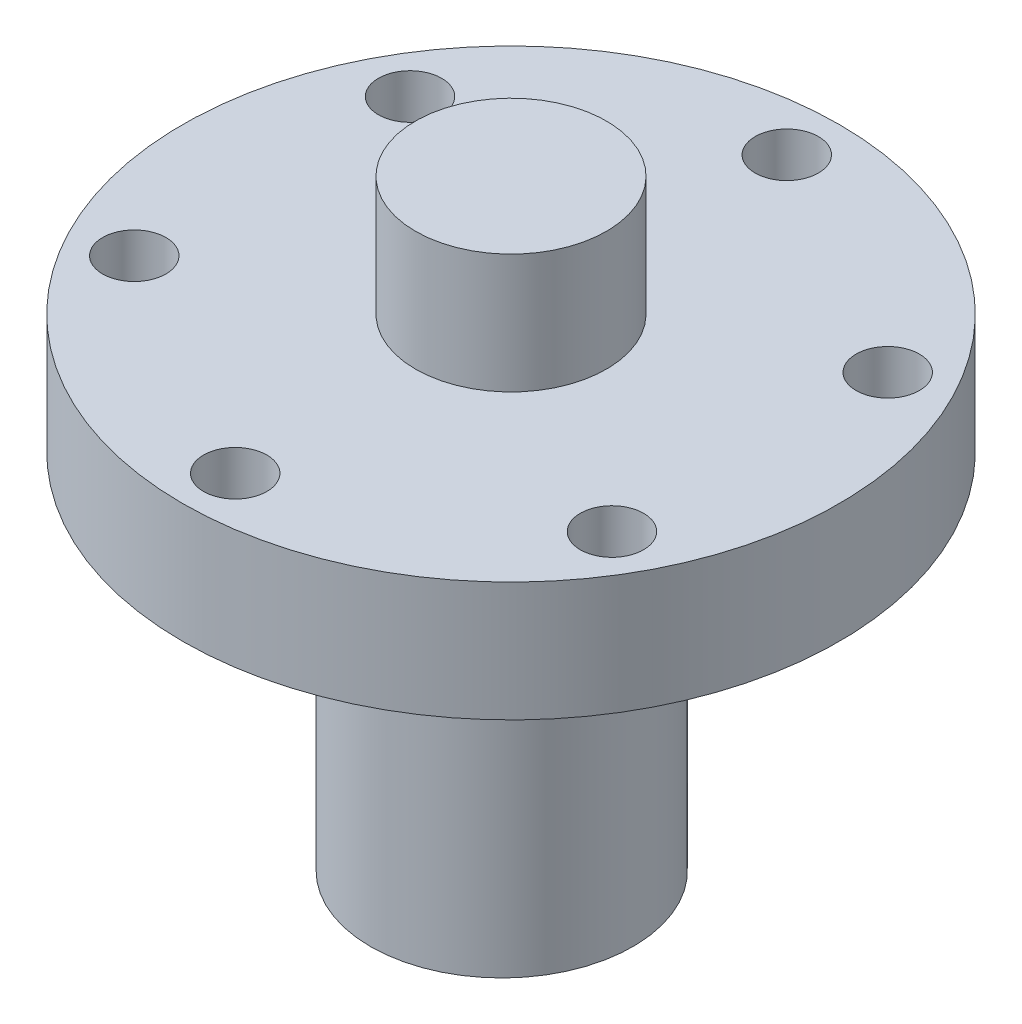
ISO-10303-21;
HEADER;
FILE_DESCRIPTION(('STEP AP214'),'2;1');
FILE_NAME('part.step','',(''),(''),'','','');
FILE_SCHEMA(('AUTOMOTIVE_DESIGN { 1 0 10303 214 1 1 1 1 }'));
ENDSEC;
DATA;
#1=APPLICATION_CONTEXT('core data for automotive mechanical design processes');
#2=APPLICATION_PROTOCOL_DEFINITION('international standard','automotive_design',2000,#1);
#3=PRODUCT_CONTEXT('',#1,'mechanical');
#4=PRODUCT('Part','Part','',(#3));
#5=PRODUCT_RELATED_PRODUCT_CATEGORY('part','',(#4));
#6=PRODUCT_DEFINITION_FORMATION('','',#4);
#7=PRODUCT_DEFINITION_CONTEXT('part definition',#1,'design');
#8=PRODUCT_DEFINITION('design','',#6,#7);
#9=PRODUCT_DEFINITION_SHAPE('','',#8);
#10=(LENGTH_UNIT() NAMED_UNIT(*) SI_UNIT(.MILLI.,.METRE.));
#11=(NAMED_UNIT(*) PLANE_ANGLE_UNIT() SI_UNIT($,.RADIAN.));
#12=(NAMED_UNIT(*) SI_UNIT($,.STERADIAN.) SOLID_ANGLE_UNIT());
#13=UNCERTAINTY_MEASURE_WITH_UNIT(LENGTH_MEASURE(1.E-05),#10,'distance_accuracy_value','');
#14=(GEOMETRIC_REPRESENTATION_CONTEXT(3) GLOBAL_UNCERTAINTY_ASSIGNED_CONTEXT((#13)) GLOBAL_UNIT_ASSIGNED_CONTEXT((#10,
#11,#12)) REPRESENTATION_CONTEXT('',''));
#15=CARTESIAN_POINT('',(0.,0.,0.));
#16=DIRECTION('',(0.,0.,1.));
#17=DIRECTION('',(1.,0.,0.));
#18=AXIS2_PLACEMENT_3D('',#15,#16,#17);
#19=CARTESIAN_POINT('',(0.,0.,0.));
#20=DIRECTION('',(0.,1.,0.));
#21=DIRECTION('',(0.,0.,1.));
#22=AXIS2_PLACEMENT_3D('',#19,#20,#21);
#23=PLANE('',#22);
#24=CARTESIAN_POINT('',(0.,0.,0.98290387426913));
#25=DIRECTION('',(0.,-1.,0.));
#26=DIRECTION('',(0.,0.,-1.));
#27=AXIS2_PLACEMENT_3D('',#24,#25,#26);
#28=CIRCLE('',#27,12.7);
#29=CARTESIAN_POINT('',(0.,0.,13.6829038742691));
#30=VERTEX_POINT('',#29);
#31=EDGE_CURVE('E100',#30,#30,#28,.T.);
#32=ORIENTED_EDGE('',*,*,#31,.T.);
#33=EDGE_LOOP('',(#32));
#34=FACE_BOUND('',#33,.T.);
#35=CARTESIAN_POINT('',(0.,0.,0.));
#36=DIRECTION('',(0.,1.,0.));
#37=DIRECTION('',(0.,0.,1.));
#38=AXIS2_PLACEMENT_3D('',#35,#36,#37);
#39=CIRCLE('',#38,2.54);
#40=CARTESIAN_POINT('',(0.,0.,2.54));
#41=VERTEX_POINT('',#40);
#42=EDGE_CURVE('E11',#41,#41,#39,.F.);
#43=ORIENTED_EDGE('',*,*,#42,.F.);
#44=EDGE_LOOP('',(#43));
#45=FACE_BOUND('',#44,.T.);
#46=ADVANCED_FACE('F34',(#34,#45),#23,.F.);
#47=CARTESIAN_POINT('',(25.4065872708242,0.,14.6684999999998));
#48=DIRECTION('',(0.,1.,0.));
#49=DIRECTION('',(-0.866025403784443,0.,-0.499999999999992));
#50=AXIS2_PLACEMENT_3D('',#47,#48,#49);
#51=CIRCLE('',#50,3.3655);
#52=CARTESIAN_POINT('',(22.4919787743877,0.,12.9857499999998));
#53=VERTEX_POINT('',#52);
#54=EDGE_CURVE('E79',#53,#53,#51,.T.);
#55=ORIENTED_EDGE('',*,*,#54,.T.);
#56=EDGE_LOOP('',(#55));
#57=FACE_BOUND('',#56,.T.);
#58=CARTESIAN_POINT('',(-25.406587270824,0.,14.6685000000001));
#59=DIRECTION('',(0.,1.,0.));
#60=DIRECTION('',(0.866025403784436,0.,-0.500000000000004));
#61=AXIS2_PLACEMENT_3D('',#58,#59,#60);
#62=CIRCLE('',#61,3.3655);
#63=CARTESIAN_POINT('',(-22.4919787743875,0.,12.9857500000001));
#64=VERTEX_POINT('',#63);
#65=EDGE_CURVE('E67',#64,#64,#62,.T.);
#66=ORIENTED_EDGE('',*,*,#65,.T.);
#67=EDGE_LOOP('',(#66));
#68=FACE_BOUND('',#67,.T.);
#69=CARTESIAN_POINT('',(0.,0.,-29.337));
#70=DIRECTION('',(0.,1.,0.));
#71=DIRECTION('',(0.,0.,1.));
#72=AXIS2_PLACEMENT_3D('',#69,#70,#71);
#73=CIRCLE('',#72,3.3655);
#74=CARTESIAN_POINT('',(0.,0.,-25.9715));
#75=VERTEX_POINT('',#74);
#76=EDGE_CURVE('E55',#75,#75,#73,.T.);
#77=ORIENTED_EDGE('',*,*,#76,.T.);
#78=EDGE_LOOP('',(#77));
#79=FACE_BOUND('',#78,.T.);
#80=CARTESIAN_POINT('',(0.,0.,0.));
#81=DIRECTION('',(0.,1.,0.));
#82=DIRECTION('',(0.,0.,1.));
#83=AXIS2_PLACEMENT_3D('',#80,#81,#82);
#84=CIRCLE('',#83,34.925);
#85=CARTESIAN_POINT('',(0.,0.,34.925));
#86=VERTEX_POINT('',#85);
#87=EDGE_CURVE('E49',#86,#86,#84,.T.);
#88=ORIENTED_EDGE('',*,*,#87,.F.);
#89=EDGE_LOOP('',(#88));
#90=FACE_BOUND('',#89,.T.);
#91=CARTESIAN_POINT('',(-25.4065872708241,0.,-14.6684999999999));
#92=DIRECTION('',(0.,1.,0.));
#93=DIRECTION('',(0.86602540378444,0.,0.499999999999998));
#94=AXIS2_PLACEMENT_3D('',#91,#92,#93);
#95=CIRCLE('',#94,3.3655);
#96=CARTESIAN_POINT('',(-22.4919787743876,0.,-12.9857499999999));
#97=VERTEX_POINT('',#96);
#98=EDGE_CURVE('E61',#97,#97,#95,.T.);
#99=ORIENTED_EDGE('',*,*,#98,.T.);
#100=EDGE_LOOP('',(#99));
#101=FACE_BOUND('',#100,.T.);
#102=CARTESIAN_POINT('',(2.04859176075282E-13,0.,29.337));
#103=DIRECTION('',(0.,1.,0.));
#104=DIRECTION('',(0.,0.,-1.));
#105=AXIS2_PLACEMENT_3D('',#102,#103,#104);
#106=CIRCLE('',#105,3.3655);
#107=CARTESIAN_POINT('',(1.81358015183529E-13,0.,25.9715));
#108=VERTEX_POINT('',#107);
#109=EDGE_CURVE('E73',#108,#108,#106,.T.);
#110=ORIENTED_EDGE('',*,*,#109,.T.);
#111=EDGE_LOOP('',(#110));
#112=FACE_BOUND('',#111,.T.);
#113=CARTESIAN_POINT('',(25.4065872708239,0.,-14.6685000000003));
#114=DIRECTION('',(0.,1.,0.));
#115=DIRECTION('',(-0.866025403784433,0.,0.50000000000001));
#116=AXIS2_PLACEMENT_3D('',#113,#114,#115);
#117=CIRCLE('',#116,3.3655);
#118=CARTESIAN_POINT('',(22.4919787743874,0.,-12.9857500000003));
#119=VERTEX_POINT('',#118);
#120=EDGE_CURVE('E85',#119,#119,#117,.T.);
#121=ORIENTED_EDGE('',*,*,#120,.T.);
#122=EDGE_LOOP('',(#121));
#123=FACE_BOUND('',#122,.T.);
#124=CARTESIAN_POINT('',(0.,0.,0.98290387426913));
#125=DIRECTION('',(0.,1.,0.));
#126=DIRECTION('',(0.,0.,1.));
#127=AXIS2_PLACEMENT_3D('',#124,#125,#126);
#128=CIRCLE('',#127,13.97);
#129=CARTESIAN_POINT('',(0.,0.,14.9529038742691));
#130=VERTEX_POINT('',#129);
#131=EDGE_CURVE('E41',#130,#130,#128,.F.);
#132=ORIENTED_EDGE('',*,*,#131,.F.);
#133=EDGE_LOOP('',(#132));
#134=FACE_BOUND('',#133,.T.);
#135=ADVANCED_FACE('F124',(#57,#68,#79,#90,#101,#112,#123,#134),#23,.F.);
#136=CARTESIAN_POINT('',(0.,12.7,0.));
#137=DIRECTION('',(0.,1.,0.));
#138=DIRECTION('',(0.,0.,1.));
#139=AXIS2_PLACEMENT_3D('',#136,#137,#138);
#140=PLANE('',#139);
#141=CARTESIAN_POINT('',(25.4065872708239,12.7,-14.6685000000003));
#142=DIRECTION('',(0.,1.,0.));
#143=DIRECTION('',(-0.866025403784433,0.,0.50000000000001));
#144=AXIS2_PLACEMENT_3D('',#141,#142,#143);
#145=CIRCLE('',#144,3.3655);
#146=CARTESIAN_POINT('',(22.4919787743874,12.7,-12.9857500000003));
#147=VERTEX_POINT('',#146);
#148=EDGE_CURVE('E82',#147,#147,#145,.T.);
#149=ORIENTED_EDGE('',*,*,#148,.F.);
#150=EDGE_LOOP('',(#149));
#151=FACE_BOUND('',#150,.T.);
#152=CARTESIAN_POINT('',(2.04859176075282E-13,12.7,29.337));
#153=DIRECTION('',(0.,1.,0.));
#154=DIRECTION('',(0.,0.,-1.));
#155=AXIS2_PLACEMENT_3D('',#152,#153,#154);
#156=CIRCLE('',#155,3.3655);
#157=CARTESIAN_POINT('',(1.81358015183529E-13,12.7,25.9715));
#158=VERTEX_POINT('',#157);
#159=EDGE_CURVE('E70',#158,#158,#156,.T.);
#160=ORIENTED_EDGE('',*,*,#159,.F.);
#161=EDGE_LOOP('',(#160));
#162=FACE_BOUND('',#161,.T.);
#163=CARTESIAN_POINT('',(-25.4065872708241,12.7,-14.6684999999999));
#164=DIRECTION('',(0.,1.,0.));
#165=DIRECTION('',(0.86602540378444,0.,0.499999999999998));
#166=AXIS2_PLACEMENT_3D('',#163,#164,#165);
#167=CIRCLE('',#166,3.3655);
#168=CARTESIAN_POINT('',(-22.4919787743876,12.7,-12.9857499999999));
#169=VERTEX_POINT('',#168);
#170=EDGE_CURVE('E58',#169,#169,#167,.T.);
#171=ORIENTED_EDGE('',*,*,#170,.F.);
#172=EDGE_LOOP('',(#171));
#173=FACE_BOUND('',#172,.T.);
#174=CARTESIAN_POINT('',(0.,12.7,0.));
#175=DIRECTION('',(0.,1.,0.));
#176=DIRECTION('',(0.,0.,1.));
#177=AXIS2_PLACEMENT_3D('',#174,#175,#176);
#178=CIRCLE('',#177,34.925);
#179=CARTESIAN_POINT('',(0.,12.7,34.925));
#180=VERTEX_POINT('',#179);
#181=EDGE_CURVE('E45',#180,#180,#178,.T.);
#182=ORIENTED_EDGE('',*,*,#181,.T.);
#183=EDGE_LOOP('',(#182));
#184=FACE_BOUND('',#183,.T.);
#185=CARTESIAN_POINT('',(0.,12.7,-29.337));
#186=DIRECTION('',(0.,1.,0.));
#187=DIRECTION('',(0.,0.,1.));
#188=AXIS2_PLACEMENT_3D('',#185,#186,#187);
#189=CIRCLE('',#188,3.3655);
#190=CARTESIAN_POINT('',(0.,12.7,-25.9715));
#191=VERTEX_POINT('',#190);
#192=EDGE_CURVE('E53',#191,#191,#189,.T.);
#193=ORIENTED_EDGE('',*,*,#192,.F.);
#194=EDGE_LOOP('',(#193));
#195=FACE_BOUND('',#194,.T.);
#196=CARTESIAN_POINT('',(-25.406587270824,12.7,14.6685000000001));
#197=DIRECTION('',(0.,1.,0.));
#198=DIRECTION('',(0.866025403784436,0.,-0.500000000000004));
#199=AXIS2_PLACEMENT_3D('',#196,#197,#198);
#200=CIRCLE('',#199,3.3655);
#201=CARTESIAN_POINT('',(-22.4919787743875,12.7,12.9857500000001));
#202=VERTEX_POINT('',#201);
#203=EDGE_CURVE('E64',#202,#202,#200,.T.);
#204=ORIENTED_EDGE('',*,*,#203,.F.);
#205=EDGE_LOOP('',(#204));
#206=FACE_BOUND('',#205,.T.);
#207=CARTESIAN_POINT('',(25.4065872708242,12.7,14.6684999999998));
#208=DIRECTION('',(0.,1.,0.));
#209=DIRECTION('',(-0.866025403784443,0.,-0.499999999999992));
#210=AXIS2_PLACEMENT_3D('',#207,#208,#209);
#211=CIRCLE('',#210,3.3655);
#212=CARTESIAN_POINT('',(22.4919787743877,12.7,12.9857499999998));
#213=VERTEX_POINT('',#212);
#214=EDGE_CURVE('E76',#213,#213,#211,.T.);
#215=ORIENTED_EDGE('',*,*,#214,.F.);
#216=EDGE_LOOP('',(#215));
#217=FACE_BOUND('',#216,.T.);
#218=CARTESIAN_POINT('',(0.,12.7,0.));
#219=DIRECTION('',(0.,1.,0.));
#220=DIRECTION('',(0.,0.,1.));
#221=AXIS2_PLACEMENT_3D('',#218,#219,#220);
#222=CIRCLE('',#221,10.16);
#223=CARTESIAN_POINT('',(0.,12.7,10.16));
#224=VERTEX_POINT('',#223);
#225=EDGE_CURVE('E91',#224,#224,#222,.T.);
#226=ORIENTED_EDGE('',*,*,#225,.F.);
#227=EDGE_LOOP('',(#226));
#228=FACE_BOUND('',#227,.T.);
#229=ADVANCED_FACE('F129',(#151,#162,#173,#184,#195,#206,#217,#228),#140,.T.);
#230=CARTESIAN_POINT('',(0.,12.7,0.));
#231=DIRECTION('',(0.,-1.,0.));
#232=DIRECTION('',(0.,0.,-1.));
#233=AXIS2_PLACEMENT_3D('',#230,#231,#232);
#234=CYLINDRICAL_SURFACE('',#233,34.925);
#235=ORIENTED_EDGE('',*,*,#181,.F.);
#236=EDGE_LOOP('',(#235));
#237=FACE_BOUND('',#236,.T.);
#238=ORIENTED_EDGE('',*,*,#87,.T.);
#239=EDGE_LOOP('',(#238));
#240=FACE_BOUND('',#239,.T.);
#241=ADVANCED_FACE('F36',(#237,#240),#234,.T.);
#242=CARTESIAN_POINT('',(0.,12.7,-29.337));
#243=DIRECTION('',(0.,-1.,0.));
#244=DIRECTION('',(0.,0.,-1.));
#245=AXIS2_PLACEMENT_3D('',#242,#243,#244);
#246=CYLINDRICAL_SURFACE('',#245,3.3655);
#247=ORIENTED_EDGE('',*,*,#192,.T.);
#248=EDGE_LOOP('',(#247));
#249=FACE_BOUND('',#248,.T.);
#250=ORIENTED_EDGE('',*,*,#76,.F.);
#251=EDGE_LOOP('',(#250));
#252=FACE_BOUND('',#251,.T.);
#253=ADVANCED_FACE('F136',(#249,#252),#246,.F.);
#254=CARTESIAN_POINT('',(-25.4065872708241,12.7,-14.6684999999999));
#255=DIRECTION('',(0.,-1.,0.));
#256=DIRECTION('',(0.,0.,-1.));
#257=AXIS2_PLACEMENT_3D('',#254,#255,#256);
#258=CYLINDRICAL_SURFACE('',#257,3.3655);
#259=ORIENTED_EDGE('',*,*,#170,.T.);
#260=EDGE_LOOP('',(#259));
#261=FACE_BOUND('',#260,.T.);
#262=ORIENTED_EDGE('',*,*,#98,.F.);
#263=EDGE_LOOP('',(#262));
#264=FACE_BOUND('',#263,.T.);
#265=ADVANCED_FACE('F139',(#261,#264),#258,.F.);
#266=CARTESIAN_POINT('',(-25.406587270824,12.7,14.6685000000001));
#267=DIRECTION('',(0.,-1.,0.));
#268=DIRECTION('',(0.,0.,-1.));
#269=AXIS2_PLACEMENT_3D('',#266,#267,#268);
#270=CYLINDRICAL_SURFACE('',#269,3.3655);
#271=ORIENTED_EDGE('',*,*,#203,.T.);
#272=EDGE_LOOP('',(#271));
#273=FACE_BOUND('',#272,.T.);
#274=ORIENTED_EDGE('',*,*,#65,.F.);
#275=EDGE_LOOP('',(#274));
#276=FACE_BOUND('',#275,.T.);
#277=ADVANCED_FACE('F143',(#273,#276),#270,.F.);
#278=CARTESIAN_POINT('',(2.04859176075282E-13,12.7,29.337));
#279=DIRECTION('',(0.,-1.,0.));
#280=DIRECTION('',(0.,0.,-1.));
#281=AXIS2_PLACEMENT_3D('',#278,#279,#280);
#282=CYLINDRICAL_SURFACE('',#281,3.3655);
#283=ORIENTED_EDGE('',*,*,#159,.T.);
#284=EDGE_LOOP('',(#283));
#285=FACE_BOUND('',#284,.T.);
#286=ORIENTED_EDGE('',*,*,#109,.F.);
#287=EDGE_LOOP('',(#286));
#288=FACE_BOUND('',#287,.T.);
#289=ADVANCED_FACE('F147',(#285,#288),#282,.F.);
#290=CARTESIAN_POINT('',(25.4065872708242,12.7,14.6684999999998));
#291=DIRECTION('',(0.,-1.,0.));
#292=DIRECTION('',(0.,0.,-1.));
#293=AXIS2_PLACEMENT_3D('',#290,#291,#292);
#294=CYLINDRICAL_SURFACE('',#293,3.3655);
#295=ORIENTED_EDGE('',*,*,#214,.T.);
#296=EDGE_LOOP('',(#295));
#297=FACE_BOUND('',#296,.T.);
#298=ORIENTED_EDGE('',*,*,#54,.F.);
#299=EDGE_LOOP('',(#298));
#300=FACE_BOUND('',#299,.T.);
#301=ADVANCED_FACE('F151',(#297,#300),#294,.F.);
#302=CARTESIAN_POINT('',(25.4065872708239,12.7,-14.6685000000003));
#303=DIRECTION('',(0.,-1.,0.));
#304=DIRECTION('',(0.,0.,-1.));
#305=AXIS2_PLACEMENT_3D('',#302,#303,#304);
#306=CYLINDRICAL_SURFACE('',#305,3.3655);
#307=ORIENTED_EDGE('',*,*,#148,.T.);
#308=EDGE_LOOP('',(#307));
#309=FACE_BOUND('',#308,.T.);
#310=ORIENTED_EDGE('',*,*,#120,.F.);
#311=EDGE_LOOP('',(#310));
#312=FACE_BOUND('',#311,.T.);
#313=ADVANCED_FACE('F155',(#309,#312),#306,.F.);
#314=CARTESIAN_POINT('',(0.,25.4,0.));
#315=DIRECTION('',(0.,-1.,0.));
#316=DIRECTION('',(0.,0.,-1.));
#317=AXIS2_PLACEMENT_3D('',#314,#315,#316);
#318=CYLINDRICAL_SURFACE('',#317,10.16);
#319=CARTESIAN_POINT('',(0.,25.4,0.));
#320=DIRECTION('',(0.,1.,0.));
#321=DIRECTION('',(0.,0.,1.));
#322=AXIS2_PLACEMENT_3D('',#319,#320,#321);
#323=CIRCLE('',#322,10.16);
#324=CARTESIAN_POINT('',(0.,25.4,10.16));
#325=VERTEX_POINT('',#324);
#326=EDGE_CURVE('E88',#325,#325,#323,.T.);
#327=ORIENTED_EDGE('',*,*,#326,.F.);
#328=EDGE_LOOP('',(#327));
#329=FACE_BOUND('',#328,.T.);
#330=ORIENTED_EDGE('',*,*,#225,.T.);
#331=EDGE_LOOP('',(#330));
#332=FACE_BOUND('',#331,.T.);
#333=ADVANCED_FACE('F159',(#329,#332),#318,.T.);
#334=CARTESIAN_POINT('',(0.,25.4,0.));
#335=DIRECTION('',(0.,1.,0.));
#336=DIRECTION('',(0.,0.,1.));
#337=AXIS2_PLACEMENT_3D('',#334,#335,#336);
#338=PLANE('',#337);
#339=ORIENTED_EDGE('',*,*,#326,.T.);
#340=EDGE_LOOP('',(#339));
#341=FACE_BOUND('',#340,.T.);
#342=ADVANCED_FACE('F163',(#341),#338,.T.);
#343=CARTESIAN_POINT('',(0.,-38.1,0.98290387426913));
#344=DIRECTION('',(0.,-1.,0.));
#345=DIRECTION('',(0.,0.,-1.));
#346=AXIS2_PLACEMENT_3D('',#343,#344,#345);
#347=PLANE('',#346);
#348=CARTESIAN_POINT('',(0.,-38.1,0.98290387426913));
#349=DIRECTION('',(0.,-1.,0.));
#350=DIRECTION('',(1.,0.,0.));
#351=AXIS2_PLACEMENT_3D('',#348,#349,#350);
#352=CIRCLE('',#351,13.97);
#353=CARTESIAN_POINT('',(0.,-38.1,14.9529038742691));
#354=VERTEX_POINT('',#353);
#355=EDGE_CURVE('E94',#354,#354,#352,.T.);
#356=ORIENTED_EDGE('',*,*,#355,.T.);
#357=EDGE_LOOP('',(#356));
#358=FACE_BOUND('',#357,.T.);
#359=CARTESIAN_POINT('',(0.,-38.1,0.98290387426913));
#360=DIRECTION('',(0.,-1.,0.));
#361=DIRECTION('',(0.,0.,-1.));
#362=AXIS2_PLACEMENT_3D('',#359,#360,#361);
#363=CIRCLE('',#362,12.7);
#364=CARTESIAN_POINT('',(0.,-38.1,13.6829038742691));
#365=VERTEX_POINT('',#364);
#366=EDGE_CURVE('E99',#365,#365,#363,.T.);
#367=ORIENTED_EDGE('',*,*,#366,.F.);
#368=EDGE_LOOP('',(#367));
#369=FACE_BOUND('',#368,.T.);
#370=ADVANCED_FACE('F167',(#358,#369),#347,.T.);
#371=CARTESIAN_POINT('',(0.,-38.1,0.98290387426913));
#372=DIRECTION('',(0.,1.,0.));
#373=DIRECTION('',(0.,0.,1.));
#374=AXIS2_PLACEMENT_3D('',#371,#372,#373);
#375=CYLINDRICAL_SURFACE('',#374,13.97);
#376=CARTESIAN_POINT('',(0.,-38.1,14.9529038742691));
#377=CARTESIAN_POINT('',(0.,-37.703125,14.9529038742691));
#378=CARTESIAN_POINT('',(0.,-37.30625,14.9529038742691));
#379=CARTESIAN_POINT('',(0.,-36.5125,14.9529038742691));
#380=CARTESIAN_POINT('',(0.,-36.115625,14.9529038742691));
#381=CARTESIAN_POINT('',(0.,-35.321875,14.9529038742691));
#382=CARTESIAN_POINT('',(0.,-34.925,14.9529038742691));
#383=CARTESIAN_POINT('',(0.,-34.13125,14.9529038742691));
#384=CARTESIAN_POINT('',(0.,-33.734375,14.9529038742691));
#385=CARTESIAN_POINT('',(0.,-32.940625,14.9529038742691));
#386=CARTESIAN_POINT('',(0.,-32.54375,14.9529038742691));
#387=CARTESIAN_POINT('',(0.,-31.75,14.9529038742691));
#388=CARTESIAN_POINT('',(0.,-31.353125,14.9529038742691));
#389=CARTESIAN_POINT('',(0.,-30.559375,14.9529038742691));
#390=CARTESIAN_POINT('',(0.,-30.1625,14.9529038742691));
#391=CARTESIAN_POINT('',(0.,-29.36875,14.9529038742691));
#392=CARTESIAN_POINT('',(0.,-28.971875,14.9529038742691));
#393=CARTESIAN_POINT('',(0.,-28.178125,14.9529038742691));
#394=CARTESIAN_POINT('',(0.,-27.78125,14.9529038742691));
#395=CARTESIAN_POINT('',(0.,-26.9875,14.9529038742691));
#396=CARTESIAN_POINT('',(0.,-26.590625,14.9529038742691));
#397=CARTESIAN_POINT('',(0.,-25.796875,14.9529038742691));
#398=CARTESIAN_POINT('',(0.,-25.4,14.9529038742691));
#399=CARTESIAN_POINT('',(0.,-24.60625,14.9529038742691));
#400=CARTESIAN_POINT('',(0.,-24.209375,14.9529038742691));
#401=CARTESIAN_POINT('',(0.,-23.415625,14.9529038742691));
#402=CARTESIAN_POINT('',(0.,-23.01875,14.9529038742691));
#403=CARTESIAN_POINT('',(0.,-22.225,14.9529038742691));
#404=CARTESIAN_POINT('',(0.,-21.828125,14.9529038742691));
#405=CARTESIAN_POINT('',(0.,-21.034375,14.9529038742691));
#406=CARTESIAN_POINT('',(0.,-20.6375,14.9529038742691));
#407=CARTESIAN_POINT('',(0.,-19.84375,14.9529038742691));
#408=CARTESIAN_POINT('',(0.,-19.446875,14.9529038742691));
#409=CARTESIAN_POINT('',(0.,-18.653125,14.9529038742691));
#410=CARTESIAN_POINT('',(0.,-18.25625,14.9529038742691));
#411=CARTESIAN_POINT('',(0.,-17.4625,14.9529038742691));
#412=CARTESIAN_POINT('',(0.,-17.065625,14.9529038742691));
#413=CARTESIAN_POINT('',(0.,-16.271875,14.9529038742691));
#414=CARTESIAN_POINT('',(0.,-15.875,14.9529038742691));
#415=CARTESIAN_POINT('',(0.,-15.08125,14.9529038742691));
#416=CARTESIAN_POINT('',(0.,-14.684375,14.9529038742691));
#417=CARTESIAN_POINT('',(0.,-13.890625,14.9529038742691));
#418=CARTESIAN_POINT('',(0.,-13.49375,14.9529038742691));
#419=CARTESIAN_POINT('',(0.,-12.7,14.9529038742691));
#420=CARTESIAN_POINT('',(0.,-12.303125,14.9529038742691));
#421=CARTESIAN_POINT('',(0.,-11.509375,14.9529038742691));
#422=CARTESIAN_POINT('',(0.,-11.1125,14.9529038742691));
#423=CARTESIAN_POINT('',(0.,-10.31875,14.9529038742691));
#424=CARTESIAN_POINT('',(0.,-9.921875,14.9529038742691));
#425=CARTESIAN_POINT('',(0.,-9.128125,14.9529038742691));
#426=CARTESIAN_POINT('',(0.,-8.73125,14.9529038742691));
#427=CARTESIAN_POINT('',(0.,-7.9375,14.9529038742691));
#428=CARTESIAN_POINT('',(0.,-7.540625,14.9529038742691));
#429=CARTESIAN_POINT('',(0.,-6.746875,14.9529038742691));
#430=CARTESIAN_POINT('',(0.,-6.35,14.9529038742691));
#431=CARTESIAN_POINT('',(0.,-5.55625,14.9529038742691));
#432=CARTESIAN_POINT('',(0.,-5.159375,14.9529038742691));
#433=CARTESIAN_POINT('',(0.,-4.365625,14.9529038742691));
#434=CARTESIAN_POINT('',(0.,-3.96875,14.9529038742691));
#435=CARTESIAN_POINT('',(0.,-3.175,14.9529038742691));
#436=CARTESIAN_POINT('',(0.,-2.778125,14.9529038742691));
#437=CARTESIAN_POINT('',(0.,-1.984375,14.9529038742691));
#438=CARTESIAN_POINT('',(0.,-1.5875,14.9529038742691));
#439=CARTESIAN_POINT('',(0.,-0.79375,14.9529038742691));
#440=CARTESIAN_POINT('',(0.,-0.396875,14.9529038742691));
#441=CARTESIAN_POINT('',(0.,0.,14.9529038742691));
#442=B_SPLINE_CURVE_WITH_KNOTS('',3,(#376,#377,#378,#379,#380,#381,#382,#383,#384,#385,#386,
#387,#388,#389,#390,#391,#392,#393,#394,#395,#396,#397,#398,#399,#400,#401,#402,#403,#404,#405,
#406,#407,#408,#409,#410,#411,#412,#413,#414,#415,#416,#417,#418,#419,#420,#421,#422,#423,#424,
#425,#426,#427,#428,#429,#430,#431,#432,#433,#434,#435,#436,#437,#438,#439,#440,#441),
.UNSPECIFIED.,.F.,.F.,(4,2,2,2,2,2,2,2,2,2,2,2,2,2,2,2,2,2,2,2,2,2,2,2,2,2,2,2,2,2,2,2,4),(0.,
1.19062499999999,2.38124999999999,3.571875,4.7625,5.953125,7.14375,8.33437499999999,9.525,
10.715625,11.90625,13.096875,14.2875,15.478125,16.66875,17.859375,19.05,20.240625,21.43125,
22.621875,23.8125,25.003125,26.19375,27.384375,28.575,29.765625,30.95625,32.146875,33.3375,
34.528125,35.71875,36.909375,38.1),.UNSPECIFIED.);
#443=EDGE_CURVE('BSEAM120',#354,#130,#442,.T.);
#444=ORIENTED_EDGE('',*,*,#355,.F.);
#445=ORIENTED_EDGE('',*,*,#131,.T.);
#446=ORIENTED_EDGE('',*,*,#443,.T.);
#447=ORIENTED_EDGE('',*,*,#443,.F.);
#448=EDGE_LOOP('',(#444,#446,#445,#447));
#449=FACE_BOUND('',#448,.T.);
#450=ADVANCED_FACE('F120',(#449),#375,.T.);
#451=CARTESIAN_POINT('',(0.,-38.1,0.98290387426913));
#452=DIRECTION('',(0.,1.,0.));
#453=DIRECTION('',(0.,0.,1.));
#454=AXIS2_PLACEMENT_3D('',#451,#452,#453);
#455=CYLINDRICAL_SURFACE('',#454,12.7);
#456=CARTESIAN_POINT('',(0.,-38.1,13.6829038742691));
#457=CARTESIAN_POINT('',(0.,-37.703125,13.6829038742691));
#458=CARTESIAN_POINT('',(0.,-37.30625,13.6829038742691));
#459=CARTESIAN_POINT('',(0.,-36.5125,13.6829038742691));
#460=CARTESIAN_POINT('',(0.,-36.115625,13.6829038742691));
#461=CARTESIAN_POINT('',(0.,-35.321875,13.6829038742691));
#462=CARTESIAN_POINT('',(0.,-34.925,13.6829038742691));
#463=CARTESIAN_POINT('',(0.,-34.13125,13.6829038742691));
#464=CARTESIAN_POINT('',(0.,-33.734375,13.6829038742691));
#465=CARTESIAN_POINT('',(0.,-32.940625,13.6829038742691));
#466=CARTESIAN_POINT('',(0.,-32.54375,13.6829038742691));
#467=CARTESIAN_POINT('',(0.,-31.75,13.6829038742691));
#468=CARTESIAN_POINT('',(0.,-31.353125,13.6829038742691));
#469=CARTESIAN_POINT('',(0.,-30.559375,13.6829038742691));
#470=CARTESIAN_POINT('',(0.,-30.1625,13.6829038742691));
#471=CARTESIAN_POINT('',(0.,-29.36875,13.6829038742691));
#472=CARTESIAN_POINT('',(0.,-28.971875,13.6829038742691));
#473=CARTESIAN_POINT('',(0.,-28.178125,13.6829038742691));
#474=CARTESIAN_POINT('',(0.,-27.78125,13.6829038742691));
#475=CARTESIAN_POINT('',(0.,-26.9875,13.6829038742691));
#476=CARTESIAN_POINT('',(0.,-26.590625,13.6829038742691));
#477=CARTESIAN_POINT('',(0.,-25.796875,13.6829038742691));
#478=CARTESIAN_POINT('',(0.,-25.4,13.6829038742691));
#479=CARTESIAN_POINT('',(0.,-24.60625,13.6829038742691));
#480=CARTESIAN_POINT('',(0.,-24.209375,13.6829038742691));
#481=CARTESIAN_POINT('',(0.,-23.415625,13.6829038742691));
#482=CARTESIAN_POINT('',(0.,-23.01875,13.6829038742691));
#483=CARTESIAN_POINT('',(0.,-22.225,13.6829038742691));
#484=CARTESIAN_POINT('',(0.,-21.828125,13.6829038742691));
#485=CARTESIAN_POINT('',(0.,-21.034375,13.6829038742691));
#486=CARTESIAN_POINT('',(0.,-20.6375,13.6829038742691));
#487=CARTESIAN_POINT('',(0.,-19.84375,13.6829038742691));
#488=CARTESIAN_POINT('',(0.,-19.446875,13.6829038742691));
#489=CARTESIAN_POINT('',(0.,-18.653125,13.6829038742691));
#490=CARTESIAN_POINT('',(0.,-18.25625,13.6829038742691));
#491=CARTESIAN_POINT('',(0.,-17.4625,13.6829038742691));
#492=CARTESIAN_POINT('',(0.,-17.065625,13.6829038742691));
#493=CARTESIAN_POINT('',(0.,-16.271875,13.6829038742691));
#494=CARTESIAN_POINT('',(0.,-15.875,13.6829038742691));
#495=CARTESIAN_POINT('',(0.,-15.08125,13.6829038742691));
#496=CARTESIAN_POINT('',(0.,-14.684375,13.6829038742691));
#497=CARTESIAN_POINT('',(0.,-13.890625,13.6829038742691));
#498=CARTESIAN_POINT('',(0.,-13.49375,13.6829038742691));
#499=CARTESIAN_POINT('',(0.,-12.7,13.6829038742691));
#500=CARTESIAN_POINT('',(0.,-12.303125,13.6829038742691));
#501=CARTESIAN_POINT('',(0.,-11.509375,13.6829038742691));
#502=CARTESIAN_POINT('',(0.,-11.1125,13.6829038742691));
#503=CARTESIAN_POINT('',(0.,-10.31875,13.6829038742691));
#504=CARTESIAN_POINT('',(0.,-9.92187499999999,13.6829038742691));
#505=CARTESIAN_POINT('',(0.,-9.128125,13.6829038742691));
#506=CARTESIAN_POINT('',(0.,-8.73124999999999,13.6829038742691));
#507=CARTESIAN_POINT('',(0.,-7.93749999999999,13.6829038742691));
#508=CARTESIAN_POINT('',(0.,-7.54062499999999,13.6829038742691));
#509=CARTESIAN_POINT('',(0.,-6.746875,13.6829038742691));
#510=CARTESIAN_POINT('',(0.,-6.35,13.6829038742691));
#511=CARTESIAN_POINT('',(0.,-5.55625,13.6829038742691));
#512=CARTESIAN_POINT('',(0.,-5.159375,13.6829038742691));
#513=CARTESIAN_POINT('',(0.,-4.365625,13.6829038742691));
#514=CARTESIAN_POINT('',(0.,-3.96875,13.6829038742691));
#515=CARTESIAN_POINT('',(0.,-3.175,13.6829038742691));
#516=CARTESIAN_POINT('',(0.,-2.778125,13.6829038742691));
#517=CARTESIAN_POINT('',(0.,-1.984375,13.6829038742691));
#518=CARTESIAN_POINT('',(0.,-1.5875,13.6829038742691));
#519=CARTESIAN_POINT('',(0.,-0.79375,13.6829038742691));
#520=CARTESIAN_POINT('',(0.,-0.396875,13.6829038742691));
#521=CARTESIAN_POINT('',(0.,0.,13.6829038742691));
#522=B_SPLINE_CURVE_WITH_KNOTS('',3,(#456,#457,#458,#459,#460,#461,#462,#463,#464,#465,#466,
#467,#468,#469,#470,#471,#472,#473,#474,#475,#476,#477,#478,#479,#480,#481,#482,#483,#484,#485,
#486,#487,#488,#489,#490,#491,#492,#493,#494,#495,#496,#497,#498,#499,#500,#501,#502,#503,#504,
#505,#506,#507,#508,#509,#510,#511,#512,#513,#514,#515,#516,#517,#518,#519,#520,#521),
.UNSPECIFIED.,.F.,.F.,(4,2,2,2,2,2,2,2,2,2,2,2,2,2,2,2,2,2,2,2,2,2,2,2,2,2,2,2,2,2,2,2,4),(0.,
1.190625,2.38125,3.571875,4.7625,5.953125,7.14375,8.334375,9.52500000000001,10.715625,11.90625,
13.096875,14.2875,15.478125,16.66875,17.859375,19.05,20.240625,21.43125,22.621875,23.8125,
25.003125,26.19375,27.384375,28.575,29.765625,30.95625,32.146875,33.3375,34.528125,35.71875,
36.909375,38.1),.UNSPECIFIED.);
#523=EDGE_CURVE('BSEAM113',#365,#30,#522,.T.);
#524=ORIENTED_EDGE('',*,*,#366,.T.);
#525=ORIENTED_EDGE('',*,*,#31,.F.);
#526=ORIENTED_EDGE('',*,*,#523,.T.);
#527=ORIENTED_EDGE('',*,*,#523,.F.);
#528=EDGE_LOOP('',(#524,#526,#525,#527));
#529=FACE_BOUND('',#528,.T.);
#530=ADVANCED_FACE('F113',(#529),#455,.F.);
#531=CARTESIAN_POINT('',(0.,-38.1,0.));
#532=DIRECTION('',(0.,1.,0.));
#533=DIRECTION('',(0.,0.,1.));
#534=AXIS2_PLACEMENT_3D('',#531,#532,#533);
#535=CYLINDRICAL_SURFACE('',#534,2.54);
#536=CARTESIAN_POINT('',(0.,-38.1,0.));
#537=DIRECTION('',(0.,-1.,0.));
#538=DIRECTION('',(0.,0.,-1.));
#539=AXIS2_PLACEMENT_3D('',#536,#537,#538);
#540=CIRCLE('',#539,2.54);
#541=CARTESIAN_POINT('',(0.,-38.1,2.54));
#542=VERTEX_POINT('',#541);
#543=EDGE_CURVE('E103',#542,#542,#540,.T.);
#544=CARTESIAN_POINT('',(0.,-38.1,2.54));
#545=CARTESIAN_POINT('',(0.,-37.703125,2.54));
#546=CARTESIAN_POINT('',(0.,-37.30625,2.54));
#547=CARTESIAN_POINT('',(0.,-36.5125,2.54));
#548=CARTESIAN_POINT('',(0.,-36.115625,2.54));
#549=CARTESIAN_POINT('',(0.,-35.321875,2.54));
#550=CARTESIAN_POINT('',(0.,-34.925,2.54));
#551=CARTESIAN_POINT('',(0.,-34.13125,2.54));
#552=CARTESIAN_POINT('',(0.,-33.734375,2.54));
#553=CARTESIAN_POINT('',(0.,-32.940625,2.54));
#554=CARTESIAN_POINT('',(0.,-32.54375,2.54));
#555=CARTESIAN_POINT('',(0.,-31.75,2.54));
#556=CARTESIAN_POINT('',(0.,-31.353125,2.54));
#557=CARTESIAN_POINT('',(0.,-30.559375,2.54));
#558=CARTESIAN_POINT('',(0.,-30.1625,2.54));
#559=CARTESIAN_POINT('',(0.,-29.36875,2.54));
#560=CARTESIAN_POINT('',(0.,-28.971875,2.54));
#561=CARTESIAN_POINT('',(0.,-28.178125,2.54));
#562=CARTESIAN_POINT('',(0.,-27.78125,2.54));
#563=CARTESIAN_POINT('',(0.,-26.9875,2.54));
#564=CARTESIAN_POINT('',(0.,-26.590625,2.54));
#565=CARTESIAN_POINT('',(0.,-25.796875,2.54));
#566=CARTESIAN_POINT('',(0.,-25.4,2.54));
#567=CARTESIAN_POINT('',(0.,-24.60625,2.54));
#568=CARTESIAN_POINT('',(0.,-24.209375,2.54));
#569=CARTESIAN_POINT('',(0.,-23.415625,2.54));
#570=CARTESIAN_POINT('',(0.,-23.01875,2.54));
#571=CARTESIAN_POINT('',(0.,-22.225,2.54));
#572=CARTESIAN_POINT('',(0.,-21.828125,2.54));
#573=CARTESIAN_POINT('',(0.,-21.034375,2.54));
#574=CARTESIAN_POINT('',(0.,-20.6375,2.54));
#575=CARTESIAN_POINT('',(0.,-19.84375,2.54));
#576=CARTESIAN_POINT('',(0.,-19.446875,2.54));
#577=CARTESIAN_POINT('',(0.,-18.653125,2.54));
#578=CARTESIAN_POINT('',(0.,-18.25625,2.54));
#579=CARTESIAN_POINT('',(0.,-17.4625,2.54));
#580=CARTESIAN_POINT('',(0.,-17.065625,2.54));
#581=CARTESIAN_POINT('',(0.,-16.271875,2.54));
#582=CARTESIAN_POINT('',(0.,-15.875,2.54));
#583=CARTESIAN_POINT('',(0.,-15.08125,2.54));
#584=CARTESIAN_POINT('',(0.,-14.684375,2.54));
#585=CARTESIAN_POINT('',(0.,-13.890625,2.54));
#586=CARTESIAN_POINT('',(0.,-13.49375,2.54));
#587=CARTESIAN_POINT('',(0.,-12.7,2.54));
#588=CARTESIAN_POINT('',(0.,-12.303125,2.54));
#589=CARTESIAN_POINT('',(0.,-11.509375,2.54));
#590=CARTESIAN_POINT('',(0.,-11.1125,2.54));
#591=CARTESIAN_POINT('',(0.,-10.31875,2.54));
#592=CARTESIAN_POINT('',(0.,-9.921875,2.54));
#593=CARTESIAN_POINT('',(0.,-9.128125,2.54));
#594=CARTESIAN_POINT('',(0.,-8.73125,2.54));
#595=CARTESIAN_POINT('',(0.,-7.9375,2.54));
#596=CARTESIAN_POINT('',(0.,-7.540625,2.54));
#597=CARTESIAN_POINT('',(0.,-6.746875,2.54));
#598=CARTESIAN_POINT('',(0.,-6.35,2.54));
#599=CARTESIAN_POINT('',(0.,-5.55625,2.54));
#600=CARTESIAN_POINT('',(0.,-5.159375,2.54));
#601=CARTESIAN_POINT('',(0.,-4.365625,2.54));
#602=CARTESIAN_POINT('',(0.,-3.96875,2.54));
#603=CARTESIAN_POINT('',(0.,-3.175,2.54));
#604=CARTESIAN_POINT('',(0.,-2.778125,2.54));
#605=CARTESIAN_POINT('',(0.,-1.984375,2.54));
#606=CARTESIAN_POINT('',(0.,-1.5875,2.54));
#607=CARTESIAN_POINT('',(0.,-0.79375,2.54));
#608=CARTESIAN_POINT('',(0.,-0.396875,2.54));
#609=CARTESIAN_POINT('',(0.,0.,2.54));
#610=B_SPLINE_CURVE_WITH_KNOTS('',3,(#544,#545,#546,#547,#548,#549,#550,#551,#552,#553,#554,
#555,#556,#557,#558,#559,#560,#561,#562,#563,#564,#565,#566,#567,#568,#569,#570,#571,#572,#573,
#574,#575,#576,#577,#578,#579,#580,#581,#582,#583,#584,#585,#586,#587,#588,#589,#590,#591,#592,
#593,#594,#595,#596,#597,#598,#599,#600,#601,#602,#603,#604,#605,#606,#607,#608,#609),
.UNSPECIFIED.,.F.,.F.,(4,2,2,2,2,2,2,2,2,2,2,2,2,2,2,2,2,2,2,2,2,2,2,2,2,2,2,2,2,2,2,2,4),(0.,
1.19062499999999,2.38124999999999,3.571875,4.7625,5.953125,7.14375,8.33437499999999,9.525,
10.715625,11.90625,13.096875,14.2875,15.478125,16.66875,17.859375,19.05,20.240625,21.43125,
22.621875,23.8125,25.003125,26.19375,27.384375,28.575,29.765625,30.95625,32.146875,33.3375,
34.528125,35.71875,36.909375,38.1),.UNSPECIFIED.);
#611=EDGE_CURVE('BSEAM111',#542,#41,#610,.T.);
#612=ORIENTED_EDGE('',*,*,#543,.F.);
#613=ORIENTED_EDGE('',*,*,#42,.T.);
#614=ORIENTED_EDGE('',*,*,#611,.T.);
#615=ORIENTED_EDGE('',*,*,#611,.F.);
#616=EDGE_LOOP('',(#612,#614,#613,#615));
#617=FACE_BOUND('',#616,.T.);
#618=ADVANCED_FACE('F111',(#617),#535,.T.);
#619=CARTESIAN_POINT('',(0.,-38.1,0.));
#620=DIRECTION('',(0.,-1.,0.));
#621=DIRECTION('',(0.,0.,-1.));
#622=AXIS2_PLACEMENT_3D('',#619,#620,#621);
#623=PLANE('',#622);
#624=ORIENTED_EDGE('',*,*,#543,.T.);
#625=EDGE_LOOP('',(#624));
#626=FACE_BOUND('',#625,.T.);
#627=ADVANCED_FACE('F109',(#626),#623,.T.);
#628=CLOSED_SHELL('',(#46,#135,#229,#241,#253,#265,#277,#289,#301,#313,#333,#342,#370,#450,#530,
#618,#627));
#629=MANIFOLD_SOLID_BREP('B2',#628);
#630=ADVANCED_BREP_SHAPE_REPRESENTATION('',(#18,#629),#14);
#631=SHAPE_DEFINITION_REPRESENTATION(#9,#630);
ENDSEC;
END-ISO-10303-21;
